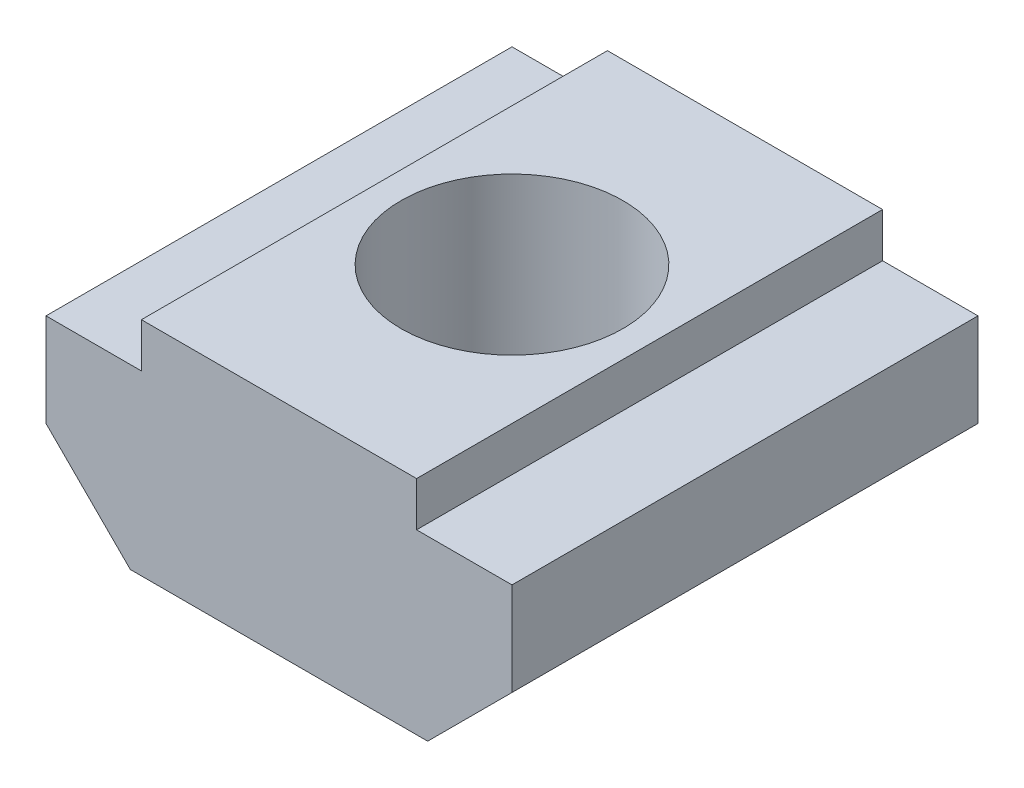
ISO-10303-21;
HEADER;
FILE_DESCRIPTION(('STEP AP214'),'2;1');
FILE_NAME('part.step','',(''),(''),'','','');
FILE_SCHEMA(('AUTOMOTIVE_DESIGN { 1 0 10303 214 1 1 1 1 }'));
ENDSEC;
DATA;
#1=APPLICATION_CONTEXT('core data for automotive mechanical design processes');
#2=APPLICATION_PROTOCOL_DEFINITION('international standard','automotive_design',2000,#1);
#3=PRODUCT_CONTEXT('',#1,'mechanical');
#4=PRODUCT('Part','Part','',(#3));
#5=PRODUCT_RELATED_PRODUCT_CATEGORY('part','',(#4));
#6=PRODUCT_DEFINITION_FORMATION('','',#4);
#7=PRODUCT_DEFINITION_CONTEXT('part definition',#1,'design');
#8=PRODUCT_DEFINITION('design','',#6,#7);
#9=PRODUCT_DEFINITION_SHAPE('','',#8);
#10=(LENGTH_UNIT() NAMED_UNIT(*) SI_UNIT(.MILLI.,.METRE.));
#11=(NAMED_UNIT(*) PLANE_ANGLE_UNIT() SI_UNIT($,.RADIAN.));
#12=(NAMED_UNIT(*) SI_UNIT($,.STERADIAN.) SOLID_ANGLE_UNIT());
#13=UNCERTAINTY_MEASURE_WITH_UNIT(LENGTH_MEASURE(1.E-05),#10,'distance_accuracy_value','');
#14=(GEOMETRIC_REPRESENTATION_CONTEXT(3) GLOBAL_UNCERTAINTY_ASSIGNED_CONTEXT((#13)) GLOBAL_UNIT_ASSIGNED_CONTEXT((#10,
#11,#12)) REPRESENTATION_CONTEXT('',''));
#15=CARTESIAN_POINT('',(0.,0.,0.));
#16=DIRECTION('',(0.,0.,1.));
#17=DIRECTION('',(1.,0.,0.));
#18=AXIS2_PLACEMENT_3D('',#15,#16,#17);
#19=CARTESIAN_POINT('',(2.92499999999998,-2.92500000000001,10.5));
#20=DIRECTION('',(0.707106781186544,-0.707106781186551,0.));
#21=DIRECTION('',(0.707106781186551,0.707106781186544,0.));
#22=AXIS2_PLACEMENT_3D('',#19,#20,#21);
#23=PLANE('',#22);
#24=DIRECTION('',(-0.707106781186551,-0.707106781186544,0.));
#25=VECTOR('',#24,1.);
#26=CARTESIAN_POINT('',(2.92499999999998,-2.92500000000001,0.));
#27=LINE('',#26,#25);
#28=CARTESIAN_POINT('',(5.25,-0.600000000000021,0.));
#29=VERTEX_POINT('',#28);
#30=CARTESIAN_POINT('',(3.35,-2.5,0.));
#31=VERTEX_POINT('',#30);
#32=EDGE_CURVE('E140',#29,#31,#27,.T.);
#33=ORIENTED_EDGE('',*,*,#32,.F.);
#34=DIRECTION('',(0.,0.,-1.));
#35=VECTOR('',#34,1.);
#36=CARTESIAN_POINT('',(5.25,-0.600000000000021,10.5));
#37=LINE('',#36,#35);
#38=CARTESIAN_POINT('',(5.25,-0.600000000000021,10.5));
#39=VERTEX_POINT('',#38);
#40=EDGE_CURVE('E11',#39,#29,#37,.T.);
#41=ORIENTED_EDGE('',*,*,#40,.F.);
#42=DIRECTION('',(-0.707106781186551,-0.707106781186544,0.));
#43=VECTOR('',#42,1.);
#44=CARTESIAN_POINT('',(2.92499999999998,-2.92500000000001,10.5));
#45=LINE('',#44,#43);
#46=CARTESIAN_POINT('',(3.35,-2.5,10.5));
#47=VERTEX_POINT('',#46);
#48=EDGE_CURVE('E165',#39,#47,#45,.T.);
#49=ORIENTED_EDGE('',*,*,#48,.T.);
#50=DIRECTION('',(0.,0.,-1.));
#51=VECTOR('',#50,1.);
#52=CARTESIAN_POINT('',(3.35,-2.5,10.5));
#53=LINE('',#52,#51);
#54=EDGE_CURVE('E91',#47,#31,#53,.T.);
#55=ORIENTED_EDGE('',*,*,#54,.T.);
#56=EDGE_LOOP('',(#33,#41,#49,#55));
#57=FACE_BOUND('',#56,.T.);
#58=ADVANCED_FACE('F35',(#57),#23,.T.);
#59=CARTESIAN_POINT('',(5.25,0.,10.5));
#60=DIRECTION('',(-1.,0.,0.));
#61=DIRECTION('',(0.,0.,1.));
#62=AXIS2_PLACEMENT_3D('',#59,#60,#61);
#63=PLANE('',#62);
#64=DIRECTION('',(0.,1.,0.));
#65=VECTOR('',#64,1.);
#66=CARTESIAN_POINT('',(5.25,0.,0.));
#67=LINE('',#66,#65);
#68=CARTESIAN_POINT('',(5.25,1.5,0.));
#69=VERTEX_POINT('',#68);
#70=EDGE_CURVE('E143',#29,#69,#67,.T.);
#71=ORIENTED_EDGE('',*,*,#70,.T.);
#72=DIRECTION('',(0.,0.,-1.));
#73=VECTOR('',#72,1.);
#74=CARTESIAN_POINT('',(5.25,1.5,10.5));
#75=LINE('',#74,#73);
#76=CARTESIAN_POINT('',(5.25,1.5,10.5));
#77=VERTEX_POINT('',#76);
#78=EDGE_CURVE('E43',#77,#69,#75,.T.);
#79=ORIENTED_EDGE('',*,*,#78,.F.);
#80=DIRECTION('',(0.,1.,0.));
#81=VECTOR('',#80,1.);
#82=CARTESIAN_POINT('',(5.25,0.,10.5));
#83=LINE('',#82,#81);
#84=EDGE_CURVE('E198',#39,#77,#83,.T.);
#85=ORIENTED_EDGE('',*,*,#84,.F.);
#86=ORIENTED_EDGE('',*,*,#40,.T.);
#87=EDGE_LOOP('',(#71,#79,#85,#86));
#88=FACE_BOUND('',#87,.T.);
#89=ADVANCED_FACE('F185',(#88),#63,.F.);
#90=CARTESIAN_POINT('',(0.,1.5,10.5));
#91=DIRECTION('',(0.,1.,0.));
#92=DIRECTION('',(-1.,0.,0.));
#93=AXIS2_PLACEMENT_3D('',#90,#91,#92);
#94=PLANE('',#93);
#95=DIRECTION('',(1.,0.,0.));
#96=VECTOR('',#95,1.);
#97=CARTESIAN_POINT('',(0.,1.5,0.));
#98=LINE('',#97,#96);
#99=CARTESIAN_POINT('',(3.1,1.5,0.));
#100=VERTEX_POINT('',#99);
#101=EDGE_CURVE('E147',#100,#69,#98,.T.);
#102=ORIENTED_EDGE('',*,*,#101,.F.);
#103=DIRECTION('',(0.,0.,-1.));
#104=VECTOR('',#103,1.);
#105=CARTESIAN_POINT('',(3.1,1.5,10.5));
#106=LINE('',#105,#104);
#107=CARTESIAN_POINT('',(3.1,1.5,10.5));
#108=VERTEX_POINT('',#107);
#109=EDGE_CURVE('E175',#108,#100,#106,.T.);
#110=ORIENTED_EDGE('',*,*,#109,.F.);
#111=DIRECTION('',(1.,0.,0.));
#112=VECTOR('',#111,1.);
#113=CARTESIAN_POINT('',(0.,1.5,10.5));
#114=LINE('',#113,#112);
#115=EDGE_CURVE('E182',#108,#77,#114,.T.);
#116=ORIENTED_EDGE('',*,*,#115,.T.);
#117=ORIENTED_EDGE('',*,*,#78,.T.);
#118=EDGE_LOOP('',(#102,#110,#116,#117));
#119=FACE_BOUND('',#118,.T.);
#120=ADVANCED_FACE('F180',(#119),#94,.T.);
#121=CARTESIAN_POINT('',(3.1,0.,10.5));
#122=DIRECTION('',(1.,0.,0.));
#123=DIRECTION('',(0.,0.,-1.));
#124=AXIS2_PLACEMENT_3D('',#121,#122,#123);
#125=PLANE('',#124);
#126=DIRECTION('',(0.,-1.,0.));
#127=VECTOR('',#126,1.);
#128=CARTESIAN_POINT('',(3.1,0.,0.));
#129=LINE('',#128,#127);
#130=CARTESIAN_POINT('',(3.1,2.5,0.));
#131=VERTEX_POINT('',#130);
#132=EDGE_CURVE('E150',#131,#100,#129,.T.);
#133=ORIENTED_EDGE('',*,*,#132,.F.);
#134=DIRECTION('',(0.,0.,-1.));
#135=VECTOR('',#134,1.);
#136=CARTESIAN_POINT('',(3.1,2.5,10.5));
#137=LINE('',#136,#135);
#138=CARTESIAN_POINT('',(3.1,2.5,10.5));
#139=VERTEX_POINT('',#138);
#140=EDGE_CURVE('E173',#139,#131,#137,.T.);
#141=ORIENTED_EDGE('',*,*,#140,.F.);
#142=DIRECTION('',(0.,-1.,0.));
#143=VECTOR('',#142,1.);
#144=CARTESIAN_POINT('',(3.1,0.,10.5));
#145=LINE('',#144,#143);
#146=EDGE_CURVE('E195',#139,#108,#145,.T.);
#147=ORIENTED_EDGE('',*,*,#146,.T.);
#148=ORIENTED_EDGE('',*,*,#109,.T.);
#149=EDGE_LOOP('',(#133,#141,#147,#148));
#150=FACE_BOUND('',#149,.T.);
#151=ADVANCED_FACE('F192',(#150),#125,.T.);
#152=CARTESIAN_POINT('',(0.,2.5,10.5));
#153=DIRECTION('',(0.,1.,0.));
#154=DIRECTION('',(0.,0.,1.));
#155=AXIS2_PLACEMENT_3D('',#152,#153,#154);
#156=PLANE('',#155);
#157=CARTESIAN_POINT('',(0.,2.5,5.25));
#158=DIRECTION('',(0.,1.,0.));
#159=DIRECTION('',(0.,0.,1.));
#160=AXIS2_PLACEMENT_3D('',#157,#158,#159);
#161=CIRCLE('',#160,2.5);
#162=CARTESIAN_POINT('',(0.,2.5,7.75));
#163=VERTEX_POINT('',#162);
#164=EDGE_CURVE('E218',#163,#163,#161,.T.);
#165=ORIENTED_EDGE('',*,*,#164,.F.);
#166=EDGE_LOOP('',(#165));
#167=FACE_BOUND('',#166,.T.);
#168=DIRECTION('',(1.,0.,0.));
#169=VECTOR('',#168,1.);
#170=CARTESIAN_POINT('',(0.,2.5,0.));
#171=LINE('',#170,#169);
#172=CARTESIAN_POINT('',(-3.1,2.5,0.));
#173=VERTEX_POINT('',#172);
#174=EDGE_CURVE('E154',#173,#131,#171,.T.);
#175=ORIENTED_EDGE('',*,*,#174,.F.);
#176=DIRECTION('',(0.,0.,-1.));
#177=VECTOR('',#176,1.);
#178=CARTESIAN_POINT('',(-3.1,2.5,10.5));
#179=LINE('',#178,#177);
#180=CARTESIAN_POINT('',(-3.1,2.5,10.5));
#181=VERTEX_POINT('',#180);
#182=EDGE_CURVE('E171',#181,#173,#179,.T.);
#183=ORIENTED_EDGE('',*,*,#182,.F.);
#184=DIRECTION('',(1.,0.,0.));
#185=VECTOR('',#184,1.);
#186=CARTESIAN_POINT('',(0.,2.5,10.5));
#187=LINE('',#186,#185);
#188=EDGE_CURVE('E200',#181,#139,#187,.T.);
#189=ORIENTED_EDGE('',*,*,#188,.T.);
#190=ORIENTED_EDGE('',*,*,#140,.T.);
#191=EDGE_LOOP('',(#175,#183,#189,#190));
#192=FACE_BOUND('',#191,.T.);
#193=ADVANCED_FACE('F209',(#167,#192),#156,.T.);
#194=CARTESIAN_POINT('',(-3.1,0.,10.5));
#195=DIRECTION('',(1.,0.,0.));
#196=DIRECTION('',(0.,1.,0.));
#197=AXIS2_PLACEMENT_3D('',#194,#195,#196);
#198=PLANE('',#197);
#199=DIRECTION('',(0.,-1.,0.));
#200=VECTOR('',#199,1.);
#201=CARTESIAN_POINT('',(-3.1,0.,0.));
#202=LINE('',#201,#200);
#203=CARTESIAN_POINT('',(-3.1,1.5,0.));
#204=VERTEX_POINT('',#203);
#205=EDGE_CURVE('E157',#173,#204,#202,.T.);
#206=ORIENTED_EDGE('',*,*,#205,.T.);
#207=DIRECTION('',(0.,0.,-1.));
#208=VECTOR('',#207,1.);
#209=CARTESIAN_POINT('',(-3.1,1.5,10.5));
#210=LINE('',#209,#208);
#211=CARTESIAN_POINT('',(-3.1,1.5,10.5));
#212=VERTEX_POINT('',#211);
#213=EDGE_CURVE('E169',#212,#204,#210,.T.);
#214=ORIENTED_EDGE('',*,*,#213,.F.);
#215=DIRECTION('',(0.,-1.,0.));
#216=VECTOR('',#215,1.);
#217=CARTESIAN_POINT('',(-3.1,0.,10.5));
#218=LINE('',#217,#216);
#219=EDGE_CURVE('E203',#181,#212,#218,.T.);
#220=ORIENTED_EDGE('',*,*,#219,.F.);
#221=ORIENTED_EDGE('',*,*,#182,.T.);
#222=EDGE_LOOP('',(#206,#214,#220,#221));
#223=FACE_BOUND('',#222,.T.);
#224=ADVANCED_FACE('F211',(#223),#198,.F.);
#225=CARTESIAN_POINT('',(-5.25,1.5,0.));
#226=VERTEX_POINT('',#225);
#227=EDGE_CURVE('E151',#226,#204,#98,.T.);
#228=ORIENTED_EDGE('',*,*,#227,.F.);
#229=DIRECTION('',(0.,0.,-1.));
#230=VECTOR('',#229,1.);
#231=CARTESIAN_POINT('',(-5.25,1.5,10.5));
#232=LINE('',#231,#230);
#233=CARTESIAN_POINT('',(-5.25,1.5,10.5));
#234=VERTEX_POINT('',#233);
#235=EDGE_CURVE('E127',#234,#226,#232,.T.);
#236=ORIENTED_EDGE('',*,*,#235,.F.);
#237=EDGE_CURVE('E133',#234,#212,#114,.T.);
#238=ORIENTED_EDGE('',*,*,#237,.T.);
#239=ORIENTED_EDGE('',*,*,#213,.T.);
#240=EDGE_LOOP('',(#228,#236,#238,#239));
#241=FACE_BOUND('',#240,.T.);
#242=ADVANCED_FACE('F214',(#241),#94,.T.);
#243=CARTESIAN_POINT('',(-5.25,0.,10.5));
#244=DIRECTION('',(-1.,0.,0.));
#245=DIRECTION('',(0.,0.,1.));
#246=AXIS2_PLACEMENT_3D('',#243,#244,#245);
#247=PLANE('',#246);
#248=DIRECTION('',(0.,1.,0.));
#249=VECTOR('',#248,1.);
#250=CARTESIAN_POINT('',(-5.25,0.,0.));
#251=LINE('',#250,#249);
#252=CARTESIAN_POINT('',(-5.25,-0.60000000000002,0.));
#253=VERTEX_POINT('',#252);
#254=EDGE_CURVE('E122',#253,#226,#251,.T.);
#255=ORIENTED_EDGE('',*,*,#254,.F.);
#256=DIRECTION('',(0.,0.,-1.));
#257=VECTOR('',#256,1.);
#258=CARTESIAN_POINT('',(-5.25,-0.60000000000002,10.5));
#259=LINE('',#258,#257);
#260=CARTESIAN_POINT('',(-5.25,-0.60000000000002,10.5));
#261=VERTEX_POINT('',#260);
#262=EDGE_CURVE('E117',#261,#253,#259,.T.);
#263=ORIENTED_EDGE('',*,*,#262,.F.);
#264=DIRECTION('',(0.,1.,0.));
#265=VECTOR('',#264,1.);
#266=CARTESIAN_POINT('',(-5.25,0.,10.5));
#267=LINE('',#266,#265);
#268=EDGE_CURVE('E120',#261,#234,#267,.T.);
#269=ORIENTED_EDGE('',*,*,#268,.T.);
#270=ORIENTED_EDGE('',*,*,#235,.T.);
#271=EDGE_LOOP('',(#255,#263,#269,#270));
#272=FACE_BOUND('',#271,.T.);
#273=ADVANCED_FACE('F119',(#272),#247,.T.);
#274=CARTESIAN_POINT('',(-2.92499999999998,-2.92500000000001,10.5));
#275=DIRECTION('',(-0.707106781186544,-0.707106781186551,0.));
#276=DIRECTION('',(0.707106781186551,-0.707106781186544,0.));
#277=AXIS2_PLACEMENT_3D('',#274,#275,#276);
#278=PLANE('',#277);
#279=DIRECTION('',(-0.707106781186551,0.707106781186544,0.));
#280=VECTOR('',#279,1.);
#281=CARTESIAN_POINT('',(-2.92499999999998,-2.92500000000001,0.));
#282=LINE('',#281,#280);
#283=CARTESIAN_POINT('',(-3.35,-2.5,0.));
#284=VERTEX_POINT('',#283);
#285=EDGE_CURVE('E161',#284,#253,#282,.T.);
#286=ORIENTED_EDGE('',*,*,#285,.F.);
#287=DIRECTION('',(0.,0.,-1.));
#288=VECTOR('',#287,1.);
#289=CARTESIAN_POINT('',(-3.35,-2.5,10.5));
#290=LINE('',#289,#288);
#291=CARTESIAN_POINT('',(-3.35,-2.5,10.5));
#292=VERTEX_POINT('',#291);
#293=EDGE_CURVE('E84',#292,#284,#290,.T.);
#294=ORIENTED_EDGE('',*,*,#293,.F.);
#295=DIRECTION('',(-0.707106781186551,0.707106781186544,0.));
#296=VECTOR('',#295,1.);
#297=CARTESIAN_POINT('',(-2.92499999999998,-2.92500000000001,10.5));
#298=LINE('',#297,#296);
#299=EDGE_CURVE('E131',#292,#261,#298,.T.);
#300=ORIENTED_EDGE('',*,*,#299,.T.);
#301=ORIENTED_EDGE('',*,*,#262,.T.);
#302=EDGE_LOOP('',(#286,#294,#300,#301));
#303=FACE_BOUND('',#302,.T.);
#304=ADVANCED_FACE('F135',(#303),#278,.T.);
#305=CARTESIAN_POINT('',(0.,-2.5,10.5));
#306=DIRECTION('',(0.,1.,0.));
#307=DIRECTION('',(0.,0.,1.));
#308=AXIS2_PLACEMENT_3D('',#305,#306,#307);
#309=PLANE('',#308);
#310=CARTESIAN_POINT('',(0.,-2.5,5.25));
#311=DIRECTION('',(0.,1.,0.));
#312=DIRECTION('',(0.,0.,1.));
#313=AXIS2_PLACEMENT_3D('',#310,#311,#312);
#314=CIRCLE('',#313,2.5);
#315=CARTESIAN_POINT('',(0.,-2.5,7.75));
#316=VERTEX_POINT('',#315);
#317=EDGE_CURVE('E144',#316,#316,#314,.T.);
#318=ORIENTED_EDGE('',*,*,#317,.T.);
#319=EDGE_LOOP('',(#318));
#320=FACE_BOUND('',#319,.T.);
#321=DIRECTION('',(1.,0.,0.));
#322=VECTOR('',#321,1.);
#323=CARTESIAN_POINT('',(0.,-2.5,0.));
#324=LINE('',#323,#322);
#325=EDGE_CURVE('E163',#284,#31,#324,.T.);
#326=ORIENTED_EDGE('',*,*,#325,.T.);
#327=ORIENTED_EDGE('',*,*,#54,.F.);
#328=DIRECTION('',(1.,0.,0.));
#329=VECTOR('',#328,1.);
#330=CARTESIAN_POINT('',(0.,-2.5,10.5));
#331=LINE('',#330,#329);
#332=EDGE_CURVE('E51',#292,#47,#331,.T.);
#333=ORIENTED_EDGE('',*,*,#332,.F.);
#334=ORIENTED_EDGE('',*,*,#293,.T.);
#335=EDGE_LOOP('',(#326,#327,#333,#334));
#336=FACE_BOUND('',#335,.T.);
#337=ADVANCED_FACE('F215',(#320,#336),#309,.F.);
#338=CARTESIAN_POINT('',(0.,0.,10.5));
#339=DIRECTION('',(0.,0.,1.));
#340=DIRECTION('',(1.,0.,0.));
#341=AXIS2_PLACEMENT_3D('',#338,#339,#340);
#342=PLANE('',#341);
#343=ORIENTED_EDGE('',*,*,#48,.F.);
#344=ORIENTED_EDGE('',*,*,#84,.T.);
#345=ORIENTED_EDGE('',*,*,#115,.F.);
#346=ORIENTED_EDGE('',*,*,#146,.F.);
#347=ORIENTED_EDGE('',*,*,#188,.F.);
#348=ORIENTED_EDGE('',*,*,#219,.T.);
#349=ORIENTED_EDGE('',*,*,#237,.F.);
#350=ORIENTED_EDGE('',*,*,#268,.F.);
#351=ORIENTED_EDGE('',*,*,#299,.F.);
#352=ORIENTED_EDGE('',*,*,#332,.T.);
#353=EDGE_LOOP('',(#343,#344,#345,#346,#347,#348,#349,#350,#351,#352));
#354=FACE_BOUND('',#353,.T.);
#355=ADVANCED_FACE('F130',(#354),#342,.T.);
#356=CARTESIAN_POINT('',(0.,0.,0.));
#357=DIRECTION('',(0.,0.,1.));
#358=DIRECTION('',(1.,0.,0.));
#359=AXIS2_PLACEMENT_3D('',#356,#357,#358);
#360=PLANE('',#359);
#361=ORIENTED_EDGE('',*,*,#32,.T.);
#362=ORIENTED_EDGE('',*,*,#325,.F.);
#363=ORIENTED_EDGE('',*,*,#285,.T.);
#364=ORIENTED_EDGE('',*,*,#254,.T.);
#365=ORIENTED_EDGE('',*,*,#227,.T.);
#366=ORIENTED_EDGE('',*,*,#205,.F.);
#367=ORIENTED_EDGE('',*,*,#174,.T.);
#368=ORIENTED_EDGE('',*,*,#132,.T.);
#369=ORIENTED_EDGE('',*,*,#101,.T.);
#370=ORIENTED_EDGE('',*,*,#70,.F.);
#371=EDGE_LOOP('',(#361,#362,#363,#364,#365,#366,#367,#368,#369,#370));
#372=FACE_BOUND('',#371,.T.);
#373=ADVANCED_FACE('F187',(#372),#360,.F.);
#374=CARTESIAN_POINT('',(0.,-2.5,5.25));
#375=DIRECTION('',(0.,1.,0.));
#376=DIRECTION('',(0.,0.,1.));
#377=AXIS2_PLACEMENT_3D('',#374,#375,#376);
#378=CYLINDRICAL_SURFACE('',#377,2.5);
#379=ORIENTED_EDGE('',*,*,#317,.F.);
#380=EDGE_LOOP('',(#379));
#381=FACE_BOUND('',#380,.T.);
#382=ORIENTED_EDGE('',*,*,#164,.T.);
#383=EDGE_LOOP('',(#382));
#384=FACE_BOUND('',#383,.T.);
#385=ADVANCED_FACE('F225',(#381,#384),#378,.F.);
#386=CLOSED_SHELL('',(#58,#89,#120,#151,#193,#224,#242,#273,#304,#337,#355,#373,#385));
#387=MANIFOLD_SOLID_BREP('B2',#386);
#388=ADVANCED_BREP_SHAPE_REPRESENTATION('',(#18,#387),#14);
#389=SHAPE_DEFINITION_REPRESENTATION(#9,#388);
ENDSEC;
END-ISO-10303-21;
